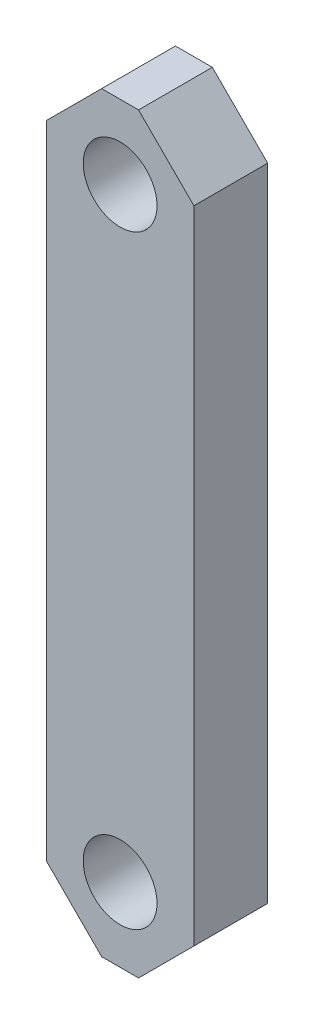
ISO-10303-21;
HEADER;
FILE_DESCRIPTION(('STEP AP214'),'2;1');
FILE_NAME('part.step','',(''),(''),'','','');
FILE_SCHEMA(('AUTOMOTIVE_DESIGN { 1 0 10303 214 1 1 1 1 }'));
ENDSEC;
DATA;
#1=APPLICATION_CONTEXT('core data for automotive mechanical design processes');
#2=APPLICATION_PROTOCOL_DEFINITION('international standard','automotive_design',2000,#1);
#3=PRODUCT_CONTEXT('',#1,'mechanical');
#4=PRODUCT('Part','Part','',(#3));
#5=PRODUCT_RELATED_PRODUCT_CATEGORY('part','',(#4));
#6=PRODUCT_DEFINITION_FORMATION('','',#4);
#7=PRODUCT_DEFINITION_CONTEXT('part definition',#1,'design');
#8=PRODUCT_DEFINITION('design','',#6,#7);
#9=PRODUCT_DEFINITION_SHAPE('','',#8);
#10=(LENGTH_UNIT() NAMED_UNIT(*) SI_UNIT(.MILLI.,.METRE.));
#11=(NAMED_UNIT(*) PLANE_ANGLE_UNIT() SI_UNIT($,.RADIAN.));
#12=(NAMED_UNIT(*) SI_UNIT($,.STERADIAN.) SOLID_ANGLE_UNIT());
#13=UNCERTAINTY_MEASURE_WITH_UNIT(LENGTH_MEASURE(1.E-05),#10,'distance_accuracy_value','');
#14=(GEOMETRIC_REPRESENTATION_CONTEXT(3) GLOBAL_UNCERTAINTY_ASSIGNED_CONTEXT((#13)) GLOBAL_UNIT_ASSIGNED_CONTEXT((#10,
#11,#12)) REPRESENTATION_CONTEXT('',''));
#15=CARTESIAN_POINT('',(0.,0.,0.));
#16=DIRECTION('',(0.,0.,1.));
#17=DIRECTION('',(1.,0.,0.));
#18=AXIS2_PLACEMENT_3D('',#15,#16,#17);
#19=CARTESIAN_POINT('',(-25.4,-129.38125,12.7));
#20=DIRECTION('',(0.,0.,1.));
#21=DIRECTION('',(1.,0.,0.));
#22=AXIS2_PLACEMENT_3D('',#19,#20,#21);
#23=PLANE('',#22);
#24=DIRECTION('',(-0.707106781186548,-0.707106781186548,0.));
#25=VECTOR('',#24,1.);
#26=CARTESIAN_POINT('',(6.35,-129.38125,12.7));
#27=LINE('',#26,#25);
#28=CARTESIAN_POINT('',(25.4,-110.33125,12.7));
#29=VERTEX_POINT('',#28);
#30=CARTESIAN_POINT('',(6.35,-129.38125,12.7));
#31=VERTEX_POINT('',#30);
#32=EDGE_CURVE('E88',#29,#31,#27,.T.);
#33=ORIENTED_EDGE('',*,*,#32,.F.);
#34=DIRECTION('',(0.,1.,0.));
#35=VECTOR('',#34,1.);
#36=CARTESIAN_POINT('',(25.4,129.38125,12.7));
#37=LINE('',#36,#35);
#38=CARTESIAN_POINT('',(25.4,110.33125,12.7));
#39=VERTEX_POINT('',#38);
#40=EDGE_CURVE('E34',#29,#39,#37,.T.);
#41=ORIENTED_EDGE('',*,*,#40,.T.);
#42=DIRECTION('',(0.707106781186548,-0.707106781186548,0.));
#43=VECTOR('',#42,1.);
#44=CARTESIAN_POINT('',(6.35,129.38125,12.7));
#45=LINE('',#44,#43);
#46=CARTESIAN_POINT('',(6.35,129.38125,12.7));
#47=VERTEX_POINT('',#46);
#48=EDGE_CURVE('E152',#47,#39,#45,.T.);
#49=ORIENTED_EDGE('',*,*,#48,.F.);
#50=DIRECTION('',(-1.,0.,0.));
#51=VECTOR('',#50,1.);
#52=CARTESIAN_POINT('',(-25.4,129.38125,12.7));
#53=LINE('',#52,#51);
#54=CARTESIAN_POINT('',(-6.35,129.38125,12.7));
#55=VERTEX_POINT('',#54);
#56=EDGE_CURVE('E11',#47,#55,#53,.T.);
#57=ORIENTED_EDGE('',*,*,#56,.T.);
#58=DIRECTION('',(0.707106781186548,0.707106781186548,0.));
#59=VECTOR('',#58,1.);
#60=CARTESIAN_POINT('',(-6.35,129.38125,12.7));
#61=LINE('',#60,#59);
#62=CARTESIAN_POINT('',(-25.4,110.33125,12.7));
#63=VERTEX_POINT('',#62);
#64=EDGE_CURVE('E141',#63,#55,#61,.T.);
#65=ORIENTED_EDGE('',*,*,#64,.F.);
#66=DIRECTION('',(0.,-1.,0.));
#67=VECTOR('',#66,1.);
#68=CARTESIAN_POINT('',(-25.4,129.38125,12.7));
#69=LINE('',#68,#67);
#70=CARTESIAN_POINT('',(-25.4,-110.33125,12.7));
#71=VERTEX_POINT('',#70);
#72=EDGE_CURVE('E109',#63,#71,#69,.T.);
#73=ORIENTED_EDGE('',*,*,#72,.T.);
#74=DIRECTION('',(-0.707106781186548,0.707106781186548,0.));
#75=VECTOR('',#74,1.);
#76=CARTESIAN_POINT('',(-25.4,-110.33125,12.7));
#77=LINE('',#76,#75);
#78=CARTESIAN_POINT('',(-6.35,-129.38125,12.7));
#79=VERTEX_POINT('',#78);
#80=EDGE_CURVE('E108',#79,#71,#77,.T.);
#81=ORIENTED_EDGE('',*,*,#80,.F.);
#82=DIRECTION('',(1.,0.,0.));
#83=VECTOR('',#82,1.);
#84=CARTESIAN_POINT('',(-25.4,-129.38125,12.7));
#85=LINE('',#84,#83);
#86=EDGE_CURVE('E101',#79,#31,#85,.T.);
#87=ORIENTED_EDGE('',*,*,#86,.T.);
#88=EDGE_LOOP('',(#33,#41,#49,#57,#65,#73,#81,#87));
#89=FACE_BOUND('',#88,.T.);
#90=CARTESIAN_POINT('',(0.,103.98125,12.7));
#91=DIRECTION('',(0.,0.,1.));
#92=DIRECTION('',(1.,0.,0.));
#93=AXIS2_PLACEMENT_3D('',#90,#91,#92);
#94=CIRCLE('',#93,12.7);
#95=CARTESIAN_POINT('',(12.7,103.98125,12.7));
#96=VERTEX_POINT('',#95);
#97=EDGE_CURVE('E121',#96,#96,#94,.T.);
#98=ORIENTED_EDGE('',*,*,#97,.F.);
#99=EDGE_LOOP('',(#98));
#100=FACE_BOUND('',#99,.T.);
#101=CARTESIAN_POINT('',(0.,-103.98125,12.7));
#102=DIRECTION('',(0.,0.,1.));
#103=DIRECTION('',(1.,0.,0.));
#104=AXIS2_PLACEMENT_3D('',#101,#102,#103);
#105=CIRCLE('',#104,12.7);
#106=CARTESIAN_POINT('',(12.7,-103.98125,12.7));
#107=VERTEX_POINT('',#106);
#108=EDGE_CURVE('E127',#107,#107,#105,.T.);
#109=ORIENTED_EDGE('',*,*,#108,.F.);
#110=EDGE_LOOP('',(#109));
#111=FACE_BOUND('',#110,.T.);
#112=ADVANCED_FACE('F26',(#89,#100,#111),#23,.T.);
#113=CARTESIAN_POINT('',(-25.4,-129.38125,-12.7));
#114=DIRECTION('',(0.,0.,1.));
#115=DIRECTION('',(1.,0.,0.));
#116=AXIS2_PLACEMENT_3D('',#113,#114,#115);
#117=PLANE('',#116);
#118=CARTESIAN_POINT('',(0.,103.98125,-12.7));
#119=DIRECTION('',(0.,0.,1.));
#120=DIRECTION('',(1.,0.,0.));
#121=AXIS2_PLACEMENT_3D('',#118,#119,#120);
#122=CIRCLE('',#121,12.7);
#123=CARTESIAN_POINT('',(12.7,103.98125,-12.7));
#124=VERTEX_POINT('',#123);
#125=EDGE_CURVE('E124',#124,#124,#122,.T.);
#126=ORIENTED_EDGE('',*,*,#125,.T.);
#127=EDGE_LOOP('',(#126));
#128=FACE_BOUND('',#127,.T.);
#129=DIRECTION('',(0.,1.,0.));
#130=VECTOR('',#129,1.);
#131=CARTESIAN_POINT('',(25.4,129.38125,-12.7));
#132=LINE('',#131,#130);
#133=CARTESIAN_POINT('',(25.4,-110.33125,-12.7));
#134=VERTEX_POINT('',#133);
#135=CARTESIAN_POINT('',(25.4,110.33125,-12.7));
#136=VERTEX_POINT('',#135);
#137=EDGE_CURVE('E115',#134,#136,#132,.T.);
#138=ORIENTED_EDGE('',*,*,#137,.F.);
#139=DIRECTION('',(-0.707106781186548,-0.707106781186548,0.));
#140=VECTOR('',#139,1.);
#141=CARTESIAN_POINT('',(6.35,-129.38125,-12.7));
#142=LINE('',#141,#140);
#143=CARTESIAN_POINT('',(6.35,-129.38125,-12.7));
#144=VERTEX_POINT('',#143);
#145=EDGE_CURVE('E41',#134,#144,#142,.T.);
#146=ORIENTED_EDGE('',*,*,#145,.T.);
#147=DIRECTION('',(1.,0.,0.));
#148=VECTOR('',#147,1.);
#149=CARTESIAN_POINT('',(-25.4,-129.38125,-12.7));
#150=LINE('',#149,#148);
#151=CARTESIAN_POINT('',(-6.35,-129.38125,-12.7));
#152=VERTEX_POINT('',#151);
#153=EDGE_CURVE('E103',#152,#144,#150,.T.);
#154=ORIENTED_EDGE('',*,*,#153,.F.);
#155=DIRECTION('',(-0.707106781186548,0.707106781186548,0.));
#156=VECTOR('',#155,1.);
#157=CARTESIAN_POINT('',(-25.4,-110.33125,-12.7));
#158=LINE('',#157,#156);
#159=CARTESIAN_POINT('',(-25.4,-110.33125,-12.7));
#160=VERTEX_POINT('',#159);
#161=EDGE_CURVE('E49',#152,#160,#158,.T.);
#162=ORIENTED_EDGE('',*,*,#161,.T.);
#163=DIRECTION('',(0.,-1.,0.));
#164=VECTOR('',#163,1.);
#165=CARTESIAN_POINT('',(-25.4,129.38125,-12.7));
#166=LINE('',#165,#164);
#167=CARTESIAN_POINT('',(-25.4,110.33125,-12.7));
#168=VERTEX_POINT('',#167);
#169=EDGE_CURVE('E118',#168,#160,#166,.T.);
#170=ORIENTED_EDGE('',*,*,#169,.F.);
#171=DIRECTION('',(0.707106781186548,0.707106781186548,0.));
#172=VECTOR('',#171,1.);
#173=CARTESIAN_POINT('',(-6.35,129.38125,-12.7));
#174=LINE('',#173,#172);
#175=CARTESIAN_POINT('',(-6.35,129.38125,-12.7));
#176=VERTEX_POINT('',#175);
#177=EDGE_CURVE('E136',#168,#176,#174,.T.);
#178=ORIENTED_EDGE('',*,*,#177,.T.);
#179=DIRECTION('',(-1.,0.,0.));
#180=VECTOR('',#179,1.);
#181=CARTESIAN_POINT('',(-25.4,129.38125,-12.7));
#182=LINE('',#181,#180);
#183=CARTESIAN_POINT('',(6.35,129.38125,-12.7));
#184=VERTEX_POINT('',#183);
#185=EDGE_CURVE('E111',#184,#176,#182,.T.);
#186=ORIENTED_EDGE('',*,*,#185,.F.);
#187=DIRECTION('',(0.707106781186548,-0.707106781186548,0.));
#188=VECTOR('',#187,1.);
#189=CARTESIAN_POINT('',(6.35,129.38125,-12.7));
#190=LINE('',#189,#188);
#191=EDGE_CURVE('E147',#184,#136,#190,.T.);
#192=ORIENTED_EDGE('',*,*,#191,.T.);
#193=EDGE_LOOP('',(#138,#146,#154,#162,#170,#178,#186,#192));
#194=FACE_BOUND('',#193,.T.);
#195=CARTESIAN_POINT('',(0.,-103.98125,-12.7));
#196=DIRECTION('',(0.,0.,1.));
#197=DIRECTION('',(1.,0.,0.));
#198=AXIS2_PLACEMENT_3D('',#195,#196,#197);
#199=CIRCLE('',#198,12.7);
#200=CARTESIAN_POINT('',(12.7,-103.98125,-12.7));
#201=VERTEX_POINT('',#200);
#202=EDGE_CURVE('E130',#201,#201,#199,.T.);
#203=ORIENTED_EDGE('',*,*,#202,.T.);
#204=EDGE_LOOP('',(#203));
#205=FACE_BOUND('',#204,.T.);
#206=ADVANCED_FACE('F165',(#128,#194,#205),#117,.F.);
#207=CARTESIAN_POINT('',(-25.4,129.38125,12.7));
#208=DIRECTION('',(1.,0.,0.));
#209=DIRECTION('',(0.,1.,0.));
#210=AXIS2_PLACEMENT_3D('',#207,#208,#209);
#211=PLANE('',#210);
#212=ORIENTED_EDGE('',*,*,#169,.T.);
#213=DIRECTION('',(0.,0.,1.));
#214=VECTOR('',#213,1.);
#215=CARTESIAN_POINT('',(-25.4,-110.33125,-12.7));
#216=LINE('',#215,#214);
#217=EDGE_CURVE('E155',#160,#71,#216,.T.);
#218=ORIENTED_EDGE('',*,*,#217,.T.);
#219=ORIENTED_EDGE('',*,*,#72,.F.);
#220=DIRECTION('',(0.,0.,1.));
#221=VECTOR('',#220,1.);
#222=CARTESIAN_POINT('',(-25.4,110.33125,-12.7));
#223=LINE('',#222,#221);
#224=EDGE_CURVE('E134',#168,#63,#223,.T.);
#225=ORIENTED_EDGE('',*,*,#224,.F.);
#226=EDGE_LOOP('',(#212,#218,#219,#225));
#227=FACE_BOUND('',#226,.T.);
#228=ADVANCED_FACE('F28',(#227),#211,.F.);
#229=CARTESIAN_POINT('',(-25.4,-129.38125,12.7));
#230=DIRECTION('',(0.,1.,0.));
#231=DIRECTION('',(0.,0.,1.));
#232=AXIS2_PLACEMENT_3D('',#229,#230,#231);
#233=PLANE('',#232);
#234=ORIENTED_EDGE('',*,*,#153,.T.);
#235=DIRECTION('',(0.,0.,1.));
#236=VECTOR('',#235,1.);
#237=CARTESIAN_POINT('',(6.35,-129.38125,-12.7));
#238=LINE('',#237,#236);
#239=EDGE_CURVE('E91',#144,#31,#238,.T.);
#240=ORIENTED_EDGE('',*,*,#239,.T.);
#241=ORIENTED_EDGE('',*,*,#86,.F.);
#242=DIRECTION('',(0.,0.,1.));
#243=VECTOR('',#242,1.);
#244=CARTESIAN_POINT('',(-6.35,-129.38125,-12.7));
#245=LINE('',#244,#243);
#246=EDGE_CURVE('E156',#152,#79,#245,.T.);
#247=ORIENTED_EDGE('',*,*,#246,.F.);
#248=EDGE_LOOP('',(#234,#240,#241,#247));
#249=FACE_BOUND('',#248,.T.);
#250=ADVANCED_FACE('F100',(#249),#233,.F.);
#251=CARTESIAN_POINT('',(25.4,129.38125,12.7));
#252=DIRECTION('',(-1.,0.,0.));
#253=DIRECTION('',(0.,-1.,0.));
#254=AXIS2_PLACEMENT_3D('',#251,#252,#253);
#255=PLANE('',#254);
#256=ORIENTED_EDGE('',*,*,#40,.F.);
#257=DIRECTION('',(0.,0.,1.));
#258=VECTOR('',#257,1.);
#259=CARTESIAN_POINT('',(25.4,-110.33125,-12.7));
#260=LINE('',#259,#258);
#261=EDGE_CURVE('E92',#134,#29,#260,.T.);
#262=ORIENTED_EDGE('',*,*,#261,.F.);
#263=ORIENTED_EDGE('',*,*,#137,.T.);
#264=DIRECTION('',(0.,0.,1.));
#265=VECTOR('',#264,1.);
#266=CARTESIAN_POINT('',(25.4,110.33125,-12.7));
#267=LINE('',#266,#265);
#268=EDGE_CURVE('E144',#136,#39,#267,.T.);
#269=ORIENTED_EDGE('',*,*,#268,.T.);
#270=EDGE_LOOP('',(#256,#262,#263,#269));
#271=FACE_BOUND('',#270,.T.);
#272=ADVANCED_FACE('F170',(#271),#255,.F.);
#273=CARTESIAN_POINT('',(-25.4,129.38125,12.7));
#274=DIRECTION('',(0.,-1.,0.));
#275=DIRECTION('',(0.,0.,-1.));
#276=AXIS2_PLACEMENT_3D('',#273,#274,#275);
#277=PLANE('',#276);
#278=ORIENTED_EDGE('',*,*,#56,.F.);
#279=DIRECTION('',(0.,0.,1.));
#280=VECTOR('',#279,1.);
#281=CARTESIAN_POINT('',(6.35,129.38125,-12.7));
#282=LINE('',#281,#280);
#283=EDGE_CURVE('E145',#184,#47,#282,.T.);
#284=ORIENTED_EDGE('',*,*,#283,.F.);
#285=ORIENTED_EDGE('',*,*,#185,.T.);
#286=DIRECTION('',(0.,0.,1.));
#287=VECTOR('',#286,1.);
#288=CARTESIAN_POINT('',(-6.35,129.38125,-12.7));
#289=LINE('',#288,#287);
#290=EDGE_CURVE('E133',#176,#55,#289,.T.);
#291=ORIENTED_EDGE('',*,*,#290,.T.);
#292=EDGE_LOOP('',(#278,#284,#285,#291));
#293=FACE_BOUND('',#292,.T.);
#294=ADVANCED_FACE('F178',(#293),#277,.F.);
#295=CARTESIAN_POINT('',(0.,103.98125,12.7));
#296=DIRECTION('',(0.,0.,-1.));
#297=DIRECTION('',(-1.,0.,0.));
#298=AXIS2_PLACEMENT_3D('',#295,#296,#297);
#299=CYLINDRICAL_SURFACE('',#298,12.7);
#300=ORIENTED_EDGE('',*,*,#97,.T.);
#301=EDGE_LOOP('',(#300));
#302=FACE_BOUND('',#301,.T.);
#303=ORIENTED_EDGE('',*,*,#125,.F.);
#304=EDGE_LOOP('',(#303));
#305=FACE_BOUND('',#304,.T.);
#306=ADVANCED_FACE('F207',(#302,#305),#299,.F.);
#307=CARTESIAN_POINT('',(0.,-103.98125,12.7));
#308=DIRECTION('',(0.,0.,-1.));
#309=DIRECTION('',(-1.,0.,0.));
#310=AXIS2_PLACEMENT_3D('',#307,#308,#309);
#311=CYLINDRICAL_SURFACE('',#310,12.7);
#312=ORIENTED_EDGE('',*,*,#108,.T.);
#313=EDGE_LOOP('',(#312));
#314=FACE_BOUND('',#313,.T.);
#315=ORIENTED_EDGE('',*,*,#202,.F.);
#316=EDGE_LOOP('',(#315));
#317=FACE_BOUND('',#316,.T.);
#318=ADVANCED_FACE('F239',(#314,#317),#311,.F.);
#319=CARTESIAN_POINT('',(-6.35,129.38125,-12.7));
#320=DIRECTION('',(0.707106781186548,-0.707106781186548,0.));
#321=DIRECTION('',(0.707106781186548,0.707106781186548,0.));
#322=AXIS2_PLACEMENT_3D('',#319,#320,#321);
#323=PLANE('',#322);
#324=ORIENTED_EDGE('',*,*,#64,.T.);
#325=ORIENTED_EDGE('',*,*,#290,.F.);
#326=ORIENTED_EDGE('',*,*,#177,.F.);
#327=ORIENTED_EDGE('',*,*,#224,.T.);
#328=EDGE_LOOP('',(#324,#325,#326,#327));
#329=FACE_BOUND('',#328,.T.);
#330=ADVANCED_FACE('F181',(#329),#323,.F.);
#331=CARTESIAN_POINT('',(6.35,129.38125,-12.7));
#332=DIRECTION('',(-0.707106781186548,-0.707106781186548,0.));
#333=DIRECTION('',(0.707106781186548,-0.707106781186548,0.));
#334=AXIS2_PLACEMENT_3D('',#331,#332,#333);
#335=PLANE('',#334);
#336=ORIENTED_EDGE('',*,*,#48,.T.);
#337=ORIENTED_EDGE('',*,*,#268,.F.);
#338=ORIENTED_EDGE('',*,*,#191,.F.);
#339=ORIENTED_EDGE('',*,*,#283,.T.);
#340=EDGE_LOOP('',(#336,#337,#338,#339));
#341=FACE_BOUND('',#340,.T.);
#342=ADVANCED_FACE('F172',(#341),#335,.F.);
#343=CARTESIAN_POINT('',(-25.4,-110.33125,-12.7));
#344=DIRECTION('',(0.707106781186548,0.707106781186548,0.));
#345=DIRECTION('',(-0.707106781186548,0.707106781186548,0.));
#346=AXIS2_PLACEMENT_3D('',#343,#344,#345);
#347=PLANE('',#346);
#348=ORIENTED_EDGE('',*,*,#80,.T.);
#349=ORIENTED_EDGE('',*,*,#217,.F.);
#350=ORIENTED_EDGE('',*,*,#161,.F.);
#351=ORIENTED_EDGE('',*,*,#246,.T.);
#352=EDGE_LOOP('',(#348,#349,#350,#351));
#353=FACE_BOUND('',#352,.T.);
#354=ADVANCED_FACE('F186',(#353),#347,.F.);
#355=CARTESIAN_POINT('',(6.35,-129.38125,-12.7));
#356=DIRECTION('',(-0.707106781186548,0.707106781186548,0.));
#357=DIRECTION('',(-0.707106781186548,-0.707106781186548,0.));
#358=AXIS2_PLACEMENT_3D('',#355,#356,#357);
#359=PLANE('',#358);
#360=ORIENTED_EDGE('',*,*,#32,.T.);
#361=ORIENTED_EDGE('',*,*,#239,.F.);
#362=ORIENTED_EDGE('',*,*,#145,.F.);
#363=ORIENTED_EDGE('',*,*,#261,.T.);
#364=EDGE_LOOP('',(#360,#361,#362,#363));
#365=FACE_BOUND('',#364,.T.);
#366=ADVANCED_FACE('F90',(#365),#359,.F.);
#367=CLOSED_SHELL('',(#112,#206,#228,#250,#272,#294,#306,#318,#330,#342,#354,#366));
#368=MANIFOLD_SOLID_BREP('B2',#367);
#369=ADVANCED_BREP_SHAPE_REPRESENTATION('',(#18,#368),#14);
#370=SHAPE_DEFINITION_REPRESENTATION(#9,#369);
ENDSEC;
END-ISO-10303-21;
